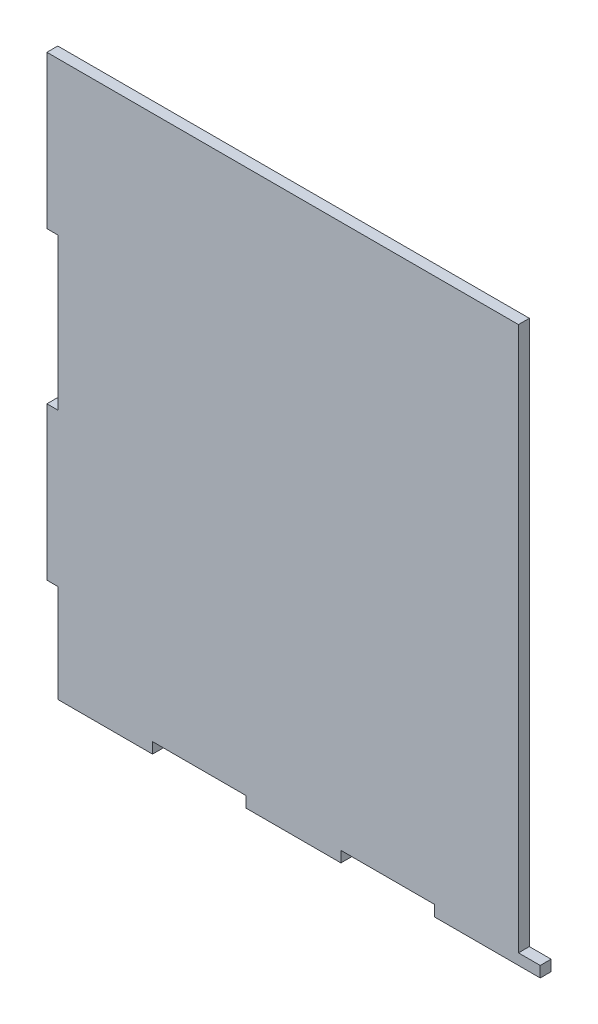
ISO-10303-21;
HEADER;
FILE_DESCRIPTION(('STEP AP214'),'2;1');
FILE_NAME('part.step','',(''),(''),'','','');
FILE_SCHEMA(('AUTOMOTIVE_DESIGN { 1 0 10303 214 1 1 1 1 }'));
ENDSEC;
DATA;
#1=APPLICATION_CONTEXT('core data for automotive mechanical design processes');
#2=APPLICATION_PROTOCOL_DEFINITION('international standard','automotive_design',2000,#1);
#3=PRODUCT_CONTEXT('',#1,'mechanical');
#4=PRODUCT('Part','Part','',(#3));
#5=PRODUCT_RELATED_PRODUCT_CATEGORY('part','',(#4));
#6=PRODUCT_DEFINITION_FORMATION('','',#4);
#7=PRODUCT_DEFINITION_CONTEXT('part definition',#1,'design');
#8=PRODUCT_DEFINITION('design','',#6,#7);
#9=PRODUCT_DEFINITION_SHAPE('','',#8);
#10=(LENGTH_UNIT() NAMED_UNIT(*) SI_UNIT(.MILLI.,.METRE.));
#11=(NAMED_UNIT(*) PLANE_ANGLE_UNIT() SI_UNIT($,.RADIAN.));
#12=(NAMED_UNIT(*) SI_UNIT($,.STERADIAN.) SOLID_ANGLE_UNIT());
#13=UNCERTAINTY_MEASURE_WITH_UNIT(LENGTH_MEASURE(1.E-05),#10,'distance_accuracy_value','');
#14=(GEOMETRIC_REPRESENTATION_CONTEXT(3) GLOBAL_UNCERTAINTY_ASSIGNED_CONTEXT((#13)) GLOBAL_UNIT_ASSIGNED_CONTEXT((#10,
#11,#12)) REPRESENTATION_CONTEXT('',''));
#15=CARTESIAN_POINT('',(0.,0.,0.));
#16=DIRECTION('',(0.,0.,1.));
#17=DIRECTION('',(1.,0.,0.));
#18=AXIS2_PLACEMENT_3D('',#15,#16,#17);
#19=CARTESIAN_POINT('',(-64.258555133079,0.,3.));
#20=DIRECTION('',(-1.,0.,0.));
#21=DIRECTION('',(0.,0.,1.));
#22=AXIS2_PLACEMENT_3D('',#19,#20,#21);
#23=PLANE('',#22);
#24=DIRECTION('',(0.,1.,0.));
#25=VECTOR('',#24,1.);
#26=CARTESIAN_POINT('',(-64.258555133079,0.,0.));
#27=LINE('',#26,#25);
#28=CARTESIAN_POINT('',(-64.258555133079,-77.1444866920169,0.));
#29=VERTEX_POINT('',#28);
#30=CARTESIAN_POINT('',(-64.258555133079,-50.1659152720151,0.));
#31=VERTEX_POINT('',#30);
#32=EDGE_CURVE('E209',#29,#31,#27,.T.);
#33=ORIENTED_EDGE('',*,*,#32,.F.);
#34=DIRECTION('',(0.,0.,-1.));
#35=VECTOR('',#34,1.);
#36=CARTESIAN_POINT('',(-64.258555133079,-77.1444866920169,3.));
#37=LINE('',#36,#35);
#38=CARTESIAN_POINT('',(-64.258555133079,-77.1444866920169,3.));
#39=VERTEX_POINT('',#38);
#40=EDGE_CURVE('E11',#39,#29,#37,.T.);
#41=ORIENTED_EDGE('',*,*,#40,.F.);
#42=DIRECTION('',(0.,1.,0.));
#43=VECTOR('',#42,1.);
#44=CARTESIAN_POINT('',(-64.258555133079,0.,3.));
#45=LINE('',#44,#43);
#46=CARTESIAN_POINT('',(-64.258555133079,-50.1659152720151,3.));
#47=VERTEX_POINT('',#46);
#48=EDGE_CURVE('E273',#39,#47,#45,.T.);
#49=ORIENTED_EDGE('',*,*,#48,.T.);
#50=DIRECTION('',(0.,0.,-1.));
#51=VECTOR('',#50,1.);
#52=CARTESIAN_POINT('',(-64.258555133079,-50.1659152720151,3.));
#53=LINE('',#52,#51);
#54=EDGE_CURVE('E127',#47,#31,#53,.T.);
#55=ORIENTED_EDGE('',*,*,#54,.T.);
#56=EDGE_LOOP('',(#33,#41,#49,#55));
#57=FACE_BOUND('',#56,.T.);
#58=ADVANCED_FACE('F39',(#57),#23,.T.);
#59=CARTESIAN_POINT('',(0.,-77.1444866920169,3.));
#60=DIRECTION('',(0.,1.,0.));
#61=DIRECTION('',(0.,0.,1.));
#62=AXIS2_PLACEMENT_3D('',#59,#60,#61);
#63=PLANE('',#62);
#64=DIRECTION('',(1.,0.,0.));
#65=VECTOR('',#64,1.);
#66=CARTESIAN_POINT('',(0.,-77.1444866920169,0.));
#67=LINE('',#66,#65);
#68=CARTESIAN_POINT('',(-38.138555133079,-77.1444866920169,0.));
#69=VERTEX_POINT('',#68);
#70=EDGE_CURVE('E213',#29,#69,#67,.T.);
#71=ORIENTED_EDGE('',*,*,#70,.T.);
#72=DIRECTION('',(0.,0.,-1.));
#73=VECTOR('',#72,1.);
#74=CARTESIAN_POINT('',(-38.138555133079,-77.1444866920169,3.));
#75=LINE('',#74,#73);
#76=CARTESIAN_POINT('',(-38.138555133079,-77.1444866920169,3.));
#77=VERTEX_POINT('',#76);
#78=EDGE_CURVE('E48',#77,#69,#75,.T.);
#79=ORIENTED_EDGE('',*,*,#78,.F.);
#80=DIRECTION('',(1.,0.,0.));
#81=VECTOR('',#80,1.);
#82=CARTESIAN_POINT('',(0.,-77.1444866920169,3.));
#83=LINE('',#82,#81);
#84=EDGE_CURVE('E413',#39,#77,#83,.T.);
#85=ORIENTED_EDGE('',*,*,#84,.F.);
#86=ORIENTED_EDGE('',*,*,#40,.T.);
#87=EDGE_LOOP('',(#71,#79,#85,#86));
#88=FACE_BOUND('',#87,.T.);
#89=ADVANCED_FACE('F418',(#88),#63,.F.);
#90=CARTESIAN_POINT('',(-38.138555133079,0.,3.));
#91=DIRECTION('',(-1.,0.,0.));
#92=DIRECTION('',(0.,0.,1.));
#93=AXIS2_PLACEMENT_3D('',#90,#91,#92);
#94=PLANE('',#93);
#95=DIRECTION('',(0.,1.,0.));
#96=VECTOR('',#95,1.);
#97=CARTESIAN_POINT('',(-38.138555133079,0.,0.));
#98=LINE('',#97,#96);
#99=CARTESIAN_POINT('',(-38.138555133079,-74.1444866920133,0.));
#100=VERTEX_POINT('',#99);
#101=EDGE_CURVE('E216',#69,#100,#98,.T.);
#102=ORIENTED_EDGE('',*,*,#101,.T.);
#103=DIRECTION('',(0.,0.,-1.));
#104=VECTOR('',#103,1.);
#105=CARTESIAN_POINT('',(-38.138555133079,-74.1444866920133,3.));
#106=LINE('',#105,#104);
#107=CARTESIAN_POINT('',(-38.138555133079,-74.1444866920133,3.));
#108=VERTEX_POINT('',#107);
#109=EDGE_CURVE('E327',#108,#100,#106,.T.);
#110=ORIENTED_EDGE('',*,*,#109,.F.);
#111=DIRECTION('',(0.,1.,0.));
#112=VECTOR('',#111,1.);
#113=CARTESIAN_POINT('',(-38.138555133079,0.,3.));
#114=LINE('',#113,#112);
#115=EDGE_CURVE('E338',#77,#108,#114,.T.);
#116=ORIENTED_EDGE('',*,*,#115,.F.);
#117=ORIENTED_EDGE('',*,*,#78,.T.);
#118=EDGE_LOOP('',(#102,#110,#116,#117));
#119=FACE_BOUND('',#118,.T.);
#120=ADVANCED_FACE('F336',(#119),#94,.F.);
#121=CARTESIAN_POINT('',(0.,-74.1444866920133,3.));
#122=DIRECTION('',(0.,1.,0.));
#123=DIRECTION('',(-1.,0.,0.));
#124=AXIS2_PLACEMENT_3D('',#121,#122,#123);
#125=PLANE('',#124);
#126=DIRECTION('',(1.,0.,0.));
#127=VECTOR('',#126,1.);
#128=CARTESIAN_POINT('',(0.,-74.1444866920133,0.));
#129=LINE('',#128,#127);
#130=CARTESIAN_POINT('',(-12.318555133079,-74.1444866920133,0.));
#131=VERTEX_POINT('',#130);
#132=EDGE_CURVE('E219',#100,#131,#129,.T.);
#133=ORIENTED_EDGE('',*,*,#132,.T.);
#134=DIRECTION('',(0.,0.,-1.));
#135=VECTOR('',#134,1.);
#136=CARTESIAN_POINT('',(-12.318555133079,-74.1444866920133,3.));
#137=LINE('',#136,#135);
#138=CARTESIAN_POINT('',(-12.318555133079,-74.1444866920133,3.));
#139=VERTEX_POINT('',#138);
#140=EDGE_CURVE('E323',#139,#131,#137,.T.);
#141=ORIENTED_EDGE('',*,*,#140,.F.);
#142=DIRECTION('',(1.,0.,0.));
#143=VECTOR('',#142,1.);
#144=CARTESIAN_POINT('',(0.,-74.1444866920133,3.));
#145=LINE('',#144,#143);
#146=EDGE_CURVE('E358',#108,#139,#145,.T.);
#147=ORIENTED_EDGE('',*,*,#146,.F.);
#148=ORIENTED_EDGE('',*,*,#109,.T.);
#149=EDGE_LOOP('',(#133,#141,#147,#148));
#150=FACE_BOUND('',#149,.T.);
#151=ADVANCED_FACE('F348',(#150),#125,.F.);
#152=CARTESIAN_POINT('',(-12.3185551330788,0.,3.));
#153=DIRECTION('',(1.,0.,0.));
#154=DIRECTION('',(0.,1.,0.));
#155=AXIS2_PLACEMENT_3D('',#152,#153,#154);
#156=PLANE('',#155);
#157=DIRECTION('',(0.,-1.,0.));
#158=VECTOR('',#157,1.);
#159=CARTESIAN_POINT('',(-12.3185551330788,0.,0.));
#160=LINE('',#159,#158);
#161=CARTESIAN_POINT('',(-12.318555133079,-77.1444866920169,0.));
#162=VERTEX_POINT('',#161);
#163=EDGE_CURVE('E222',#131,#162,#160,.T.);
#164=ORIENTED_EDGE('',*,*,#163,.T.);
#165=DIRECTION('',(0.,0.,-1.));
#166=VECTOR('',#165,1.);
#167=CARTESIAN_POINT('',(-12.318555133079,-77.1444866920169,3.));
#168=LINE('',#167,#166);
#169=CARTESIAN_POINT('',(-12.318555133079,-77.1444866920169,3.));
#170=VERTEX_POINT('',#169);
#171=EDGE_CURVE('E319',#170,#162,#168,.T.);
#172=ORIENTED_EDGE('',*,*,#171,.F.);
#173=DIRECTION('',(0.,-1.,0.));
#174=VECTOR('',#173,1.);
#175=CARTESIAN_POINT('',(-12.3185551330788,0.,3.));
#176=LINE('',#175,#174);
#177=EDGE_CURVE('E354',#139,#170,#176,.T.);
#178=ORIENTED_EDGE('',*,*,#177,.F.);
#179=ORIENTED_EDGE('',*,*,#140,.T.);
#180=EDGE_LOOP('',(#164,#172,#178,#179));
#181=FACE_BOUND('',#180,.T.);
#182=ADVANCED_FACE('F352',(#181),#156,.F.);
#183=CARTESIAN_POINT('',(0.,-77.1444866920169,3.));
#184=DIRECTION('',(0.,1.,0.));
#185=DIRECTION('',(0.,0.,1.));
#186=AXIS2_PLACEMENT_3D('',#183,#184,#185);
#187=PLANE('',#186);
#188=DIRECTION('',(1.,0.,0.));
#189=VECTOR('',#188,1.);
#190=CARTESIAN_POINT('',(0.,-77.1444866920169,0.));
#191=LINE('',#190,#189);
#192=CARTESIAN_POINT('',(13.801444866921,-77.1444866920169,0.));
#193=VERTEX_POINT('',#192);
#194=EDGE_CURVE('E225',#162,#193,#191,.T.);
#195=ORIENTED_EDGE('',*,*,#194,.T.);
#196=DIRECTION('',(0.,0.,-1.));
#197=VECTOR('',#196,1.);
#198=CARTESIAN_POINT('',(13.801444866921,-77.1444866920169,3.));
#199=LINE('',#198,#197);
#200=CARTESIAN_POINT('',(13.801444866921,-77.1444866920169,3.));
#201=VERTEX_POINT('',#200);
#202=EDGE_CURVE('E315',#201,#193,#199,.T.);
#203=ORIENTED_EDGE('',*,*,#202,.F.);
#204=DIRECTION('',(1.,0.,0.));
#205=VECTOR('',#204,1.);
#206=CARTESIAN_POINT('',(0.,-77.1444866920169,3.));
#207=LINE('',#206,#205);
#208=EDGE_CURVE('E357',#170,#201,#207,.T.);
#209=ORIENTED_EDGE('',*,*,#208,.F.);
#210=ORIENTED_EDGE('',*,*,#171,.T.);
#211=EDGE_LOOP('',(#195,#203,#209,#210));
#212=FACE_BOUND('',#211,.T.);
#213=ADVANCED_FACE('F430',(#212),#187,.F.);
#214=CARTESIAN_POINT('',(13.8014448669212,0.,3.));
#215=DIRECTION('',(-1.,0.,0.));
#216=DIRECTION('',(0.,-1.,0.));
#217=AXIS2_PLACEMENT_3D('',#214,#215,#216);
#218=PLANE('',#217);
#219=DIRECTION('',(0.,1.,0.));
#220=VECTOR('',#219,1.);
#221=CARTESIAN_POINT('',(13.8014448669212,0.,0.));
#222=LINE('',#221,#220);
#223=CARTESIAN_POINT('',(13.8014448669211,-74.1444866920133,0.));
#224=VERTEX_POINT('',#223);
#225=EDGE_CURVE('E228',#193,#224,#222,.T.);
#226=ORIENTED_EDGE('',*,*,#225,.T.);
#227=DIRECTION('',(0.,0.,-1.));
#228=VECTOR('',#227,1.);
#229=CARTESIAN_POINT('',(13.8014448669211,-74.1444866920133,3.));
#230=LINE('',#229,#228);
#231=CARTESIAN_POINT('',(13.8014448669211,-74.1444866920133,3.));
#232=VERTEX_POINT('',#231);
#233=EDGE_CURVE('E311',#232,#224,#230,.T.);
#234=ORIENTED_EDGE('',*,*,#233,.F.);
#235=DIRECTION('',(0.,1.,0.));
#236=VECTOR('',#235,1.);
#237=CARTESIAN_POINT('',(13.8014448669212,0.,3.));
#238=LINE('',#237,#236);
#239=EDGE_CURVE('E362',#201,#232,#238,.T.);
#240=ORIENTED_EDGE('',*,*,#239,.F.);
#241=ORIENTED_EDGE('',*,*,#202,.T.);
#242=EDGE_LOOP('',(#226,#234,#240,#241));
#243=FACE_BOUND('',#242,.T.);
#244=ADVANCED_FACE('F433',(#243),#218,.F.);
#245=CARTESIAN_POINT('',(0.,-74.1444866920133,3.));
#246=DIRECTION('',(0.,1.,0.));
#247=DIRECTION('',(0.,0.,1.));
#248=AXIS2_PLACEMENT_3D('',#245,#246,#247);
#249=PLANE('',#248);
#250=DIRECTION('',(1.,0.,0.));
#251=VECTOR('',#250,1.);
#252=CARTESIAN_POINT('',(0.,-74.1444866920133,0.));
#253=LINE('',#252,#251);
#254=CARTESIAN_POINT('',(39.6214448669211,-74.1444866920133,0.));
#255=VERTEX_POINT('',#254);
#256=EDGE_CURVE('E231',#224,#255,#253,.T.);
#257=ORIENTED_EDGE('',*,*,#256,.T.);
#258=DIRECTION('',(0.,0.,-1.));
#259=VECTOR('',#258,1.);
#260=CARTESIAN_POINT('',(39.6214448669211,-74.1444866920133,3.));
#261=LINE('',#260,#259);
#262=CARTESIAN_POINT('',(39.6214448669211,-74.1444866920133,3.));
#263=VERTEX_POINT('',#262);
#264=EDGE_CURVE('E307',#263,#255,#261,.T.);
#265=ORIENTED_EDGE('',*,*,#264,.F.);
#266=DIRECTION('',(1.,0.,0.));
#267=VECTOR('',#266,1.);
#268=CARTESIAN_POINT('',(0.,-74.1444866920133,3.));
#269=LINE('',#268,#267);
#270=EDGE_CURVE('E369',#232,#263,#269,.T.);
#271=ORIENTED_EDGE('',*,*,#270,.F.);
#272=ORIENTED_EDGE('',*,*,#233,.T.);
#273=EDGE_LOOP('',(#257,#265,#271,#272));
#274=FACE_BOUND('',#273,.T.);
#275=ADVANCED_FACE('F437',(#274),#249,.F.);
#276=CARTESIAN_POINT('',(39.6214448669211,0.,3.));
#277=DIRECTION('',(1.,0.,0.));
#278=DIRECTION('',(0.,0.,-1.));
#279=AXIS2_PLACEMENT_3D('',#276,#277,#278);
#280=PLANE('',#279);
#281=DIRECTION('',(0.,-1.,0.));
#282=VECTOR('',#281,1.);
#283=CARTESIAN_POINT('',(39.6214448669211,0.,0.));
#284=LINE('',#283,#282);
#285=CARTESIAN_POINT('',(39.6214448669211,-77.1444866920169,0.));
#286=VERTEX_POINT('',#285);
#287=EDGE_CURVE('E234',#255,#286,#284,.T.);
#288=ORIENTED_EDGE('',*,*,#287,.T.);
#289=DIRECTION('',(0.,0.,-1.));
#290=VECTOR('',#289,1.);
#291=CARTESIAN_POINT('',(39.6214448669211,-77.1444866920169,3.));
#292=LINE('',#291,#290);
#293=CARTESIAN_POINT('',(39.6214448669211,-77.1444866920169,3.));
#294=VERTEX_POINT('',#293);
#295=EDGE_CURVE('E304',#294,#286,#292,.T.);
#296=ORIENTED_EDGE('',*,*,#295,.F.);
#297=DIRECTION('',(0.,-1.,0.));
#298=VECTOR('',#297,1.);
#299=CARTESIAN_POINT('',(39.6214448669211,0.,3.));
#300=LINE('',#299,#298);
#301=EDGE_CURVE('E372',#263,#294,#300,.T.);
#302=ORIENTED_EDGE('',*,*,#301,.F.);
#303=ORIENTED_EDGE('',*,*,#264,.T.);
#304=EDGE_LOOP('',(#288,#296,#302,#303));
#305=FACE_BOUND('',#304,.T.);
#306=ADVANCED_FACE('F441',(#305),#280,.F.);
#307=CARTESIAN_POINT('',(0.,-77.1444866920169,3.));
#308=DIRECTION('',(0.,-1.,0.));
#309=DIRECTION('',(0.,0.,-1.));
#310=AXIS2_PLACEMENT_3D('',#307,#308,#309);
#311=PLANE('',#310);
#312=DIRECTION('',(-1.,0.,0.));
#313=VECTOR('',#312,1.);
#314=CARTESIAN_POINT('',(0.,-77.1444866920169,0.));
#315=LINE('',#314,#313);
#316=CARTESIAN_POINT('',(68.7414448669247,-77.1444866920169,0.));
#317=VERTEX_POINT('',#316);
#318=EDGE_CURVE('E238',#317,#286,#315,.T.);
#319=ORIENTED_EDGE('',*,*,#318,.F.);
#320=DIRECTION('',(0.,0.,-1.));
#321=VECTOR('',#320,1.);
#322=CARTESIAN_POINT('',(68.7414448669247,-77.1444866920169,3.));
#323=LINE('',#322,#321);
#324=CARTESIAN_POINT('',(68.7414448669247,-77.1444866920169,3.));
#325=VERTEX_POINT('',#324);
#326=EDGE_CURVE('E301',#325,#317,#323,.T.);
#327=ORIENTED_EDGE('',*,*,#326,.F.);
#328=DIRECTION('',(-1.,0.,0.));
#329=VECTOR('',#328,1.);
#330=CARTESIAN_POINT('',(0.,-77.1444866920169,3.));
#331=LINE('',#330,#329);
#332=EDGE_CURVE('E375',#325,#294,#331,.T.);
#333=ORIENTED_EDGE('',*,*,#332,.T.);
#334=ORIENTED_EDGE('',*,*,#295,.T.);
#335=EDGE_LOOP('',(#319,#327,#333,#334));
#336=FACE_BOUND('',#335,.T.);
#337=ADVANCED_FACE('F445',(#336),#311,.T.);
#338=CARTESIAN_POINT('',(68.7414448669247,0.,3.));
#339=DIRECTION('',(-1.,0.,0.));
#340=DIRECTION('',(0.,0.,1.));
#341=AXIS2_PLACEMENT_3D('',#338,#339,#340);
#342=PLANE('',#341);
#343=DIRECTION('',(0.,1.,0.));
#344=VECTOR('',#343,1.);
#345=CARTESIAN_POINT('',(68.7414448669247,0.,0.));
#346=LINE('',#345,#344);
#347=CARTESIAN_POINT('',(68.7414448669247,-74.1444866920133,0.));
#348=VERTEX_POINT('',#347);
#349=EDGE_CURVE('E242',#317,#348,#346,.T.);
#350=ORIENTED_EDGE('',*,*,#349,.T.);
#351=DIRECTION('',(0.,0.,-1.));
#352=VECTOR('',#351,1.);
#353=CARTESIAN_POINT('',(68.7414448669247,-74.1444866920133,3.));
#354=LINE('',#353,#352);
#355=CARTESIAN_POINT('',(68.7414448669247,-74.1444866920133,3.));
#356=VERTEX_POINT('',#355);
#357=EDGE_CURVE('E298',#356,#348,#354,.T.);
#358=ORIENTED_EDGE('',*,*,#357,.F.);
#359=DIRECTION('',(0.,1.,0.));
#360=VECTOR('',#359,1.);
#361=CARTESIAN_POINT('',(68.7414448669247,0.,3.));
#362=LINE('',#361,#360);
#363=EDGE_CURVE('E379',#325,#356,#362,.T.);
#364=ORIENTED_EDGE('',*,*,#363,.F.);
#365=ORIENTED_EDGE('',*,*,#326,.T.);
#366=EDGE_LOOP('',(#350,#358,#364,#365));
#367=FACE_BOUND('',#366,.T.);
#368=ADVANCED_FACE('F449',(#367),#342,.F.);
#369=CARTESIAN_POINT('',(0.,-74.1444866920133,3.));
#370=DIRECTION('',(0.,1.,0.));
#371=DIRECTION('',(0.,0.,1.));
#372=AXIS2_PLACEMENT_3D('',#369,#370,#371);
#373=PLANE('',#372);
#374=DIRECTION('',(1.,0.,0.));
#375=VECTOR('',#374,1.);
#376=CARTESIAN_POINT('',(0.,-74.1444866920133,0.));
#377=LINE('',#376,#375);
#378=CARTESIAN_POINT('',(62.7414448669174,-74.1444866920133,0.));
#379=VERTEX_POINT('',#378);
#380=EDGE_CURVE('E246',#379,#348,#377,.T.);
#381=ORIENTED_EDGE('',*,*,#380,.F.);
#382=DIRECTION('',(0.,0.,-1.));
#383=VECTOR('',#382,1.);
#384=CARTESIAN_POINT('',(62.7414448669174,-74.1444866920133,3.));
#385=LINE('',#384,#383);
#386=CARTESIAN_POINT('',(62.7414448669174,-74.1444866920133,3.));
#387=VERTEX_POINT('',#386);
#388=EDGE_CURVE('E295',#387,#379,#385,.T.);
#389=ORIENTED_EDGE('',*,*,#388,.F.);
#390=DIRECTION('',(1.,0.,0.));
#391=VECTOR('',#390,1.);
#392=CARTESIAN_POINT('',(0.,-74.1444866920133,3.));
#393=LINE('',#392,#391);
#394=EDGE_CURVE('E382',#387,#356,#393,.T.);
#395=ORIENTED_EDGE('',*,*,#394,.T.);
#396=ORIENTED_EDGE('',*,*,#357,.T.);
#397=EDGE_LOOP('',(#381,#389,#395,#396));
#398=FACE_BOUND('',#397,.T.);
#399=ADVANCED_FACE('F453',(#398),#373,.T.);
#400=CARTESIAN_POINT('',(62.7414448669174,0.,3.));
#401=DIRECTION('',(1.,0.,0.));
#402=DIRECTION('',(0.,1.,0.));
#403=AXIS2_PLACEMENT_3D('',#400,#401,#402);
#404=PLANE('',#403);
#405=DIRECTION('',(0.,-1.,0.));
#406=VECTOR('',#405,1.);
#407=CARTESIAN_POINT('',(62.7414448669174,0.,0.));
#408=LINE('',#407,#406);
#409=CARTESIAN_POINT('',(62.7414448669174,75.8555133079849,0.));
#410=VERTEX_POINT('',#409);
#411=EDGE_CURVE('E250',#410,#379,#408,.T.);
#412=ORIENTED_EDGE('',*,*,#411,.F.);
#413=DIRECTION('',(0.,0.,-1.));
#414=VECTOR('',#413,1.);
#415=CARTESIAN_POINT('',(62.7414448669174,75.8555133079849,3.));
#416=LINE('',#415,#414);
#417=CARTESIAN_POINT('',(62.7414448669174,75.8555133079849,3.));
#418=VERTEX_POINT('',#417);
#419=EDGE_CURVE('E292',#418,#410,#416,.T.);
#420=ORIENTED_EDGE('',*,*,#419,.F.);
#421=DIRECTION('',(0.,-1.,0.));
#422=VECTOR('',#421,1.);
#423=CARTESIAN_POINT('',(62.7414448669174,0.,3.));
#424=LINE('',#423,#422);
#425=EDGE_CURVE('E386',#418,#387,#424,.T.);
#426=ORIENTED_EDGE('',*,*,#425,.T.);
#427=ORIENTED_EDGE('',*,*,#388,.T.);
#428=EDGE_LOOP('',(#412,#420,#426,#427));
#429=FACE_BOUND('',#428,.T.);
#430=ADVANCED_FACE('F457',(#429),#404,.T.);
#431=CARTESIAN_POINT('',(0.,75.8555133079849,3.));
#432=DIRECTION('',(0.,-1.,0.));
#433=DIRECTION('',(0.,0.,-1.));
#434=AXIS2_PLACEMENT_3D('',#431,#432,#433);
#435=PLANE('',#434);
#436=DIRECTION('',(-1.,0.,0.));
#437=VECTOR('',#436,1.);
#438=CARTESIAN_POINT('',(0.,75.8555133079849,0.));
#439=LINE('',#438,#437);
#440=CARTESIAN_POINT('',(-67.2585551330827,75.8555133079849,0.));
#441=VERTEX_POINT('',#440);
#442=EDGE_CURVE('E254',#410,#441,#439,.T.);
#443=ORIENTED_EDGE('',*,*,#442,.T.);
#444=DIRECTION('',(0.,0.,-1.));
#445=VECTOR('',#444,1.);
#446=CARTESIAN_POINT('',(-67.2585551330827,75.8555133079849,3.));
#447=LINE('',#446,#445);
#448=CARTESIAN_POINT('',(-67.2585551330827,75.8555133079849,3.));
#449=VERTEX_POINT('',#448);
#450=EDGE_CURVE('E288',#449,#441,#447,.T.);
#451=ORIENTED_EDGE('',*,*,#450,.F.);
#452=DIRECTION('',(-1.,0.,0.));
#453=VECTOR('',#452,1.);
#454=CARTESIAN_POINT('',(0.,75.8555133079849,3.));
#455=LINE('',#454,#453);
#456=EDGE_CURVE('E390',#418,#449,#455,.T.);
#457=ORIENTED_EDGE('',*,*,#456,.F.);
#458=ORIENTED_EDGE('',*,*,#419,.T.);
#459=EDGE_LOOP('',(#443,#451,#457,#458));
#460=FACE_BOUND('',#459,.T.);
#461=ADVANCED_FACE('F461',(#460),#435,.F.);
#462=CARTESIAN_POINT('',(-67.2585551330826,0.,3.));
#463=DIRECTION('',(1.,0.,0.));
#464=DIRECTION('',(0.,1.,0.));
#465=AXIS2_PLACEMENT_3D('',#462,#463,#464);
#466=PLANE('',#465);
#467=DIRECTION('',(0.,-1.,0.));
#468=VECTOR('',#467,1.);
#469=CARTESIAN_POINT('',(-67.2585551330826,0.,0.));
#470=LINE('',#469,#468);
#471=CARTESIAN_POINT('',(-67.2585551330826,33.7483704479846,0.));
#472=VERTEX_POINT('',#471);
#473=EDGE_CURVE('E257',#441,#472,#470,.T.);
#474=ORIENTED_EDGE('',*,*,#473,.T.);
#475=DIRECTION('',(0.,0.,-1.));
#476=VECTOR('',#475,1.);
#477=CARTESIAN_POINT('',(-67.2585551330826,33.7483704479846,3.));
#478=LINE('',#477,#476);
#479=CARTESIAN_POINT('',(-67.2585551330826,33.7483704479846,3.));
#480=VERTEX_POINT('',#479);
#481=EDGE_CURVE('E284',#480,#472,#478,.T.);
#482=ORIENTED_EDGE('',*,*,#481,.F.);
#483=DIRECTION('',(0.,-1.,0.));
#484=VECTOR('',#483,1.);
#485=CARTESIAN_POINT('',(-67.2585551330826,0.,3.));
#486=LINE('',#485,#484);
#487=EDGE_CURVE('E393',#449,#480,#486,.T.);
#488=ORIENTED_EDGE('',*,*,#487,.F.);
#489=ORIENTED_EDGE('',*,*,#450,.T.);
#490=EDGE_LOOP('',(#474,#482,#488,#489));
#491=FACE_BOUND('',#490,.T.);
#492=ADVANCED_FACE('F465',(#491),#466,.F.);
#493=CARTESIAN_POINT('',(0.,33.7483704479846,3.));
#494=DIRECTION('',(0.,1.,0.));
#495=DIRECTION('',(0.,0.,1.));
#496=AXIS2_PLACEMENT_3D('',#493,#494,#495);
#497=PLANE('',#496);
#498=DIRECTION('',(1.,0.,0.));
#499=VECTOR('',#498,1.);
#500=CARTESIAN_POINT('',(0.,33.7483704479846,0.));
#501=LINE('',#500,#499);
#502=CARTESIAN_POINT('',(-64.258555133079,33.7483704479846,0.));
#503=VERTEX_POINT('',#502);
#504=EDGE_CURVE('E260',#472,#503,#501,.T.);
#505=ORIENTED_EDGE('',*,*,#504,.T.);
#506=DIRECTION('',(0.,0.,-1.));
#507=VECTOR('',#506,1.);
#508=CARTESIAN_POINT('',(-64.258555133079,33.7483704479846,3.));
#509=LINE('',#508,#507);
#510=CARTESIAN_POINT('',(-64.258555133079,33.7483704479846,3.));
#511=VERTEX_POINT('',#510);
#512=EDGE_CURVE('E280',#511,#503,#509,.T.);
#513=ORIENTED_EDGE('',*,*,#512,.F.);
#514=DIRECTION('',(1.,0.,0.));
#515=VECTOR('',#514,1.);
#516=CARTESIAN_POINT('',(0.,33.7483704479846,3.));
#517=LINE('',#516,#515);
#518=EDGE_CURVE('E396',#480,#511,#517,.T.);
#519=ORIENTED_EDGE('',*,*,#518,.F.);
#520=ORIENTED_EDGE('',*,*,#481,.T.);
#521=EDGE_LOOP('',(#505,#513,#519,#520));
#522=FACE_BOUND('',#521,.T.);
#523=ADVANCED_FACE('F404',(#522),#497,.F.);
#524=CARTESIAN_POINT('',(-64.258555133079,0.,3.));
#525=DIRECTION('',(1.,0.,0.));
#526=DIRECTION('',(0.,0.,-1.));
#527=AXIS2_PLACEMENT_3D('',#524,#525,#526);
#528=PLANE('',#527);
#529=DIRECTION('',(0.,-1.,0.));
#530=VECTOR('',#529,1.);
#531=CARTESIAN_POINT('',(-64.258555133079,0.,0.));
#532=LINE('',#531,#530);
#533=CARTESIAN_POINT('',(-64.258555133079,-8.05877241201515,0.));
#534=VERTEX_POINT('',#533);
#535=EDGE_CURVE('E263',#503,#534,#532,.T.);
#536=ORIENTED_EDGE('',*,*,#535,.T.);
#537=DIRECTION('',(0.,0.,-1.));
#538=VECTOR('',#537,1.);
#539=CARTESIAN_POINT('',(-64.258555133079,-8.05877241201515,3.));
#540=LINE('',#539,#538);
#541=CARTESIAN_POINT('',(-64.258555133079,-8.05877241201515,3.));
#542=VERTEX_POINT('',#541);
#543=EDGE_CURVE('E199',#542,#534,#540,.T.);
#544=ORIENTED_EDGE('',*,*,#543,.F.);
#545=DIRECTION('',(0.,-1.,0.));
#546=VECTOR('',#545,1.);
#547=CARTESIAN_POINT('',(-64.258555133079,0.,3.));
#548=LINE('',#547,#546);
#549=EDGE_CURVE('E188',#511,#542,#548,.T.);
#550=ORIENTED_EDGE('',*,*,#549,.F.);
#551=ORIENTED_EDGE('',*,*,#512,.T.);
#552=EDGE_LOOP('',(#536,#544,#550,#551));
#553=FACE_BOUND('',#552,.T.);
#554=ADVANCED_FACE('F408',(#553),#528,.F.);
#555=CARTESIAN_POINT('',(0.,-8.05877241201515,3.));
#556=DIRECTION('',(0.,-1.,0.));
#557=DIRECTION('',(0.,0.,-1.));
#558=AXIS2_PLACEMENT_3D('',#555,#556,#557);
#559=PLANE('',#558);
#560=DIRECTION('',(-1.,0.,0.));
#561=VECTOR('',#560,1.);
#562=CARTESIAN_POINT('',(0.,-8.05877241201515,0.));
#563=LINE('',#562,#561);
#564=CARTESIAN_POINT('',(-67.2585551330826,-8.05877241201515,0.));
#565=VERTEX_POINT('',#564);
#566=EDGE_CURVE('E197',#534,#565,#563,.T.);
#567=ORIENTED_EDGE('',*,*,#566,.T.);
#568=DIRECTION('',(0.,0.,-1.));
#569=VECTOR('',#568,1.);
#570=CARTESIAN_POINT('',(-67.2585551330826,-8.05877241201515,3.));
#571=LINE('',#570,#569);
#572=CARTESIAN_POINT('',(-67.2585551330826,-8.05877241201515,3.));
#573=VERTEX_POINT('',#572);
#574=EDGE_CURVE('E194',#573,#565,#571,.T.);
#575=ORIENTED_EDGE('',*,*,#574,.F.);
#576=DIRECTION('',(-1.,0.,0.));
#577=VECTOR('',#576,1.);
#578=CARTESIAN_POINT('',(0.,-8.05877241201515,3.));
#579=LINE('',#578,#577);
#580=EDGE_CURVE('E182',#542,#573,#579,.T.);
#581=ORIENTED_EDGE('',*,*,#580,.F.);
#582=ORIENTED_EDGE('',*,*,#543,.T.);
#583=EDGE_LOOP('',(#567,#575,#581,#582));
#584=FACE_BOUND('',#583,.T.);
#585=ADVANCED_FACE('F195',(#584),#559,.F.);
#586=CARTESIAN_POINT('',(-67.2585551330826,0.,3.));
#587=DIRECTION('',(1.,0.,0.));
#588=DIRECTION('',(0.,0.,-1.));
#589=AXIS2_PLACEMENT_3D('',#586,#587,#588);
#590=PLANE('',#589);
#591=DIRECTION('',(0.,-1.,0.));
#592=VECTOR('',#591,1.);
#593=CARTESIAN_POINT('',(-67.2585551330826,0.,0.));
#594=LINE('',#593,#592);
#595=CARTESIAN_POINT('',(-67.2585551330826,-50.1659152720151,0.));
#596=VERTEX_POINT('',#595);
#597=EDGE_CURVE('E120',#565,#596,#594,.T.);
#598=ORIENTED_EDGE('',*,*,#597,.T.);
#599=DIRECTION('',(0.,0.,-1.));
#600=VECTOR('',#599,1.);
#601=CARTESIAN_POINT('',(-67.2585551330826,-50.1659152720151,3.));
#602=LINE('',#601,#600);
#603=CARTESIAN_POINT('',(-67.2585551330826,-50.1659152720151,3.));
#604=VERTEX_POINT('',#603);
#605=EDGE_CURVE('E200',#604,#596,#602,.T.);
#606=ORIENTED_EDGE('',*,*,#605,.F.);
#607=DIRECTION('',(0.,-1.,0.));
#608=VECTOR('',#607,1.);
#609=CARTESIAN_POINT('',(-67.2585551330826,0.,3.));
#610=LINE('',#609,#608);
#611=EDGE_CURVE('E186',#573,#604,#610,.T.);
#612=ORIENTED_EDGE('',*,*,#611,.F.);
#613=ORIENTED_EDGE('',*,*,#574,.T.);
#614=EDGE_LOOP('',(#598,#606,#612,#613));
#615=FACE_BOUND('',#614,.T.);
#616=ADVANCED_FACE('F202',(#615),#590,.F.);
#617=CARTESIAN_POINT('',(1.16031987888162E-13,-50.165915272015,3.));
#618=DIRECTION('',(0.,1.,0.));
#619=DIRECTION('',(-1.,0.,0.));
#620=AXIS2_PLACEMENT_3D('',#617,#618,#619);
#621=PLANE('',#620);
#622=DIRECTION('',(1.,0.,0.));
#623=VECTOR('',#622,1.);
#624=CARTESIAN_POINT('',(1.16031987888162E-13,-50.165915272015,0.));
#625=LINE('',#624,#623);
#626=EDGE_CURVE('E270',#596,#31,#625,.T.);
#627=ORIENTED_EDGE('',*,*,#626,.T.);
#628=ORIENTED_EDGE('',*,*,#54,.F.);
#629=DIRECTION('',(1.,0.,0.));
#630=VECTOR('',#629,1.);
#631=CARTESIAN_POINT('',(1.16031987888162E-13,-50.165915272015,3.));
#632=LINE('',#631,#630);
#633=EDGE_CURVE('E56',#604,#47,#632,.T.);
#634=ORIENTED_EDGE('',*,*,#633,.F.);
#635=ORIENTED_EDGE('',*,*,#605,.T.);
#636=EDGE_LOOP('',(#627,#628,#634,#635));
#637=FACE_BOUND('',#636,.T.);
#638=ADVANCED_FACE('F411',(#637),#621,.F.);
#639=CARTESIAN_POINT('',(0.,0.,3.));
#640=DIRECTION('',(0.,0.,1.));
#641=DIRECTION('',(1.,0.,0.));
#642=AXIS2_PLACEMENT_3D('',#639,#640,#641);
#643=PLANE('',#642);
#644=ORIENTED_EDGE('',*,*,#48,.F.);
#645=ORIENTED_EDGE('',*,*,#84,.T.);
#646=ORIENTED_EDGE('',*,*,#115,.T.);
#647=ORIENTED_EDGE('',*,*,#146,.T.);
#648=ORIENTED_EDGE('',*,*,#177,.T.);
#649=ORIENTED_EDGE('',*,*,#208,.T.);
#650=ORIENTED_EDGE('',*,*,#239,.T.);
#651=ORIENTED_EDGE('',*,*,#270,.T.);
#652=ORIENTED_EDGE('',*,*,#301,.T.);
#653=ORIENTED_EDGE('',*,*,#332,.F.);
#654=ORIENTED_EDGE('',*,*,#363,.T.);
#655=ORIENTED_EDGE('',*,*,#394,.F.);
#656=ORIENTED_EDGE('',*,*,#425,.F.);
#657=ORIENTED_EDGE('',*,*,#456,.T.);
#658=ORIENTED_EDGE('',*,*,#487,.T.);
#659=ORIENTED_EDGE('',*,*,#518,.T.);
#660=ORIENTED_EDGE('',*,*,#549,.T.);
#661=ORIENTED_EDGE('',*,*,#580,.T.);
#662=ORIENTED_EDGE('',*,*,#611,.T.);
#663=ORIENTED_EDGE('',*,*,#633,.T.);
#664=EDGE_LOOP('',(#644,#645,#646,#647,#648,#649,#650,#651,#652,#653,#654,#655,#656,#657,#658,
#659,#660,#661,#662,#663));
#665=FACE_BOUND('',#664,.T.);
#666=ADVANCED_FACE('F184',(#665),#643,.T.);
#667=CARTESIAN_POINT('',(0.,0.,0.));
#668=DIRECTION('',(0.,0.,1.));
#669=DIRECTION('',(1.,0.,0.));
#670=AXIS2_PLACEMENT_3D('',#667,#668,#669);
#671=PLANE('',#670);
#672=ORIENTED_EDGE('',*,*,#32,.T.);
#673=ORIENTED_EDGE('',*,*,#626,.F.);
#674=ORIENTED_EDGE('',*,*,#597,.F.);
#675=ORIENTED_EDGE('',*,*,#566,.F.);
#676=ORIENTED_EDGE('',*,*,#535,.F.);
#677=ORIENTED_EDGE('',*,*,#504,.F.);
#678=ORIENTED_EDGE('',*,*,#473,.F.);
#679=ORIENTED_EDGE('',*,*,#442,.F.);
#680=ORIENTED_EDGE('',*,*,#411,.T.);
#681=ORIENTED_EDGE('',*,*,#380,.T.);
#682=ORIENTED_EDGE('',*,*,#349,.F.);
#683=ORIENTED_EDGE('',*,*,#318,.T.);
#684=ORIENTED_EDGE('',*,*,#287,.F.);
#685=ORIENTED_EDGE('',*,*,#256,.F.);
#686=ORIENTED_EDGE('',*,*,#225,.F.);
#687=ORIENTED_EDGE('',*,*,#194,.F.);
#688=ORIENTED_EDGE('',*,*,#163,.F.);
#689=ORIENTED_EDGE('',*,*,#132,.F.);
#690=ORIENTED_EDGE('',*,*,#101,.F.);
#691=ORIENTED_EDGE('',*,*,#70,.F.);
#692=EDGE_LOOP('',(#672,#673,#674,#675,#676,#677,#678,#679,#680,#681,#682,#683,#684,#685,#686,
#687,#688,#689,#690,#691));
#693=FACE_BOUND('',#692,.T.);
#694=ADVANCED_FACE('F343',(#693),#671,.F.);
#695=CLOSED_SHELL('',(#58,#89,#120,#151,#182,#213,#244,#275,#306,#337,#368,#399,#430,#461,#492,
#523,#554,#585,#616,#638,#666,#694));
#696=MANIFOLD_SOLID_BREP('B2',#695);
#697=ADVANCED_BREP_SHAPE_REPRESENTATION('',(#18,#696),#14);
#698=SHAPE_DEFINITION_REPRESENTATION(#9,#697);
ENDSEC;
END-ISO-10303-21;
